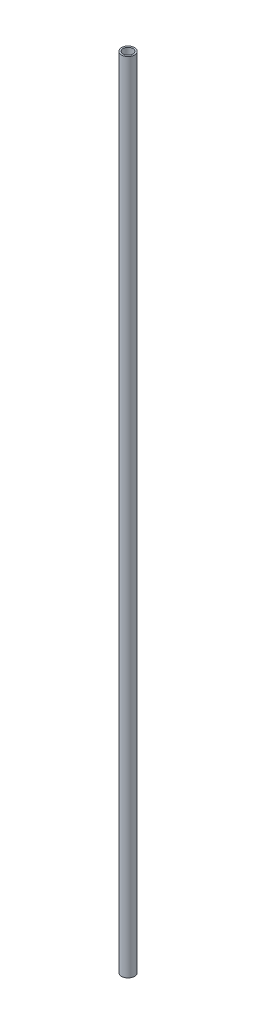
ISO-10303-21;
HEADER;
FILE_DESCRIPTION(('STEP AP214'),'2;1');
FILE_NAME('part.step','',(''),(''),'','','');
FILE_SCHEMA(('AUTOMOTIVE_DESIGN { 1 0 10303 214 1 1 1 1 }'));
ENDSEC;
DATA;
#1=APPLICATION_CONTEXT('core data for automotive mechanical design processes');
#2=APPLICATION_PROTOCOL_DEFINITION('international standard','automotive_design',2000,#1);
#3=PRODUCT_CONTEXT('',#1,'mechanical');
#4=PRODUCT('Part','Part','',(#3));
#5=PRODUCT_RELATED_PRODUCT_CATEGORY('part','',(#4));
#6=PRODUCT_DEFINITION_FORMATION('','',#4);
#7=PRODUCT_DEFINITION_CONTEXT('part definition',#1,'design');
#8=PRODUCT_DEFINITION('design','',#6,#7);
#9=PRODUCT_DEFINITION_SHAPE('','',#8);
#10=(LENGTH_UNIT() NAMED_UNIT(*) SI_UNIT(.MILLI.,.METRE.));
#11=(NAMED_UNIT(*) PLANE_ANGLE_UNIT() SI_UNIT($,.RADIAN.));
#12=(NAMED_UNIT(*) SI_UNIT($,.STERADIAN.) SOLID_ANGLE_UNIT());
#13=UNCERTAINTY_MEASURE_WITH_UNIT(LENGTH_MEASURE(1.E-05),#10,'distance_accuracy_value','');
#14=(GEOMETRIC_REPRESENTATION_CONTEXT(3) GLOBAL_UNCERTAINTY_ASSIGNED_CONTEXT((#13)) GLOBAL_UNIT_ASSIGNED_CONTEXT((#10,
#11,#12)) REPRESENTATION_CONTEXT('',''));
#15=CARTESIAN_POINT('',(0.,0.,0.));
#16=DIRECTION('',(0.,0.,1.));
#17=DIRECTION('',(1.,0.,0.));
#18=AXIS2_PLACEMENT_3D('',#15,#16,#17);
#19=CARTESIAN_POINT('',(0.,112.7,0.));
#20=DIRECTION('',(0.,1.,0.));
#21=DIRECTION('',(0.,0.,1.));
#22=AXIS2_PLACEMENT_3D('',#19,#20,#21);
#23=PLANE('',#22);
#24=CARTESIAN_POINT('',(0.,112.7,0.));
#25=DIRECTION('',(0.,1.,0.));
#26=DIRECTION('',(0.,0.,1.));
#27=AXIS2_PLACEMENT_3D('',#24,#25,#26);
#28=CIRCLE('',#27,0.9144);
#29=CARTESIAN_POINT('',(0.,112.7,-0.9144));
#30=VERTEX_POINT('',#29);
#31=EDGE_CURVE('E10',#30,#30,#28,.T.);
#32=ORIENTED_EDGE('',*,*,#31,.T.);
#33=EDGE_LOOP('',(#32));
#34=FACE_BOUND('',#33,.T.);
#35=CARTESIAN_POINT('',(0.,112.7,0.));
#36=DIRECTION('',(0.,1.,0.));
#37=DIRECTION('',(0.,0.,1.));
#38=AXIS2_PLACEMENT_3D('',#35,#36,#37);
#39=CIRCLE('',#38,0.6858);
#40=CARTESIAN_POINT('',(0.,112.7,-0.6858));
#41=VERTEX_POINT('',#40);
#42=EDGE_CURVE('E41',#41,#41,#39,.T.);
#43=ORIENTED_EDGE('',*,*,#42,.F.);
#44=EDGE_LOOP('',(#43));
#45=FACE_BOUND('',#44,.T.);
#46=ADVANCED_FACE('F30',(#34,#45),#23,.T.);
#47=CARTESIAN_POINT('',(0.,0.,0.));
#48=DIRECTION('',(0.,1.,0.));
#49=DIRECTION('',(0.,0.,1.));
#50=AXIS2_PLACEMENT_3D('',#47,#48,#49);
#51=PLANE('',#50);
#52=CARTESIAN_POINT('',(0.,0.,0.));
#53=DIRECTION('',(0.,1.,0.));
#54=DIRECTION('',(0.,0.,1.));
#55=AXIS2_PLACEMENT_3D('',#52,#53,#54);
#56=CIRCLE('',#55,0.9144);
#57=CARTESIAN_POINT('',(0.,0.,-0.9144));
#58=VERTEX_POINT('',#57);
#59=EDGE_CURVE('E34',#58,#58,#56,.T.);
#60=ORIENTED_EDGE('',*,*,#59,.F.);
#61=EDGE_LOOP('',(#60));
#62=FACE_BOUND('',#61,.T.);
#63=CARTESIAN_POINT('',(0.,0.,0.));
#64=DIRECTION('',(0.,1.,0.));
#65=DIRECTION('',(0.,0.,1.));
#66=AXIS2_PLACEMENT_3D('',#63,#64,#65);
#67=CIRCLE('',#66,0.6858);
#68=CARTESIAN_POINT('',(0.,0.,-0.6858));
#69=VERTEX_POINT('',#68);
#70=EDGE_CURVE('E43',#69,#69,#67,.T.);
#71=ORIENTED_EDGE('',*,*,#70,.T.);
#72=EDGE_LOOP('',(#71));
#73=FACE_BOUND('',#72,.T.);
#74=ADVANCED_FACE('F53',(#62,#73),#51,.F.);
#75=CARTESIAN_POINT('',(0.,112.7,0.));
#76=DIRECTION('',(0.,-1.,0.));
#77=DIRECTION('',(0.,0.,-1.));
#78=AXIS2_PLACEMENT_3D('',#75,#76,#77);
#79=CYLINDRICAL_SURFACE('',#78,0.9144);
#80=CARTESIAN_POINT('',(0.,112.7,-0.9144));
#81=CARTESIAN_POINT('',(0.,111.526041666667,-0.9144));
#82=CARTESIAN_POINT('',(0.,110.352083333333,-0.9144));
#83=CARTESIAN_POINT('',(0.,108.004166666667,-0.9144));
#84=CARTESIAN_POINT('',(0.,106.830208333333,-0.9144));
#85=CARTESIAN_POINT('',(0.,104.482291666667,-0.9144));
#86=CARTESIAN_POINT('',(0.,103.308333333333,-0.9144));
#87=CARTESIAN_POINT('',(0.,100.960416666667,-0.9144));
#88=CARTESIAN_POINT('',(0.,99.7864583333333,-0.9144));
#89=CARTESIAN_POINT('',(0.,97.4385416666667,-0.9144));
#90=CARTESIAN_POINT('',(0.,96.2645833333333,-0.9144));
#91=CARTESIAN_POINT('',(0.,93.9166666666667,-0.9144));
#92=CARTESIAN_POINT('',(0.,92.7427083333333,-0.9144));
#93=CARTESIAN_POINT('',(0.,90.3947916666667,-0.9144));
#94=CARTESIAN_POINT('',(0.,89.2208333333333,-0.9144));
#95=CARTESIAN_POINT('',(0.,86.8729166666667,-0.9144));
#96=CARTESIAN_POINT('',(0.,85.6989583333333,-0.9144));
#97=CARTESIAN_POINT('',(0.,83.3510416666667,-0.9144));
#98=CARTESIAN_POINT('',(0.,82.1770833333333,-0.9144));
#99=CARTESIAN_POINT('',(0.,79.8291666666667,-0.9144));
#100=CARTESIAN_POINT('',(0.,78.6552083333333,-0.9144));
#101=CARTESIAN_POINT('',(0.,76.3072916666667,-0.9144));
#102=CARTESIAN_POINT('',(0.,75.1333333333333,-0.9144));
#103=CARTESIAN_POINT('',(0.,72.7854166666667,-0.9144));
#104=CARTESIAN_POINT('',(0.,71.6114583333333,-0.9144));
#105=CARTESIAN_POINT('',(0.,69.2635416666667,-0.9144));
#106=CARTESIAN_POINT('',(0.,68.0895833333333,-0.9144));
#107=CARTESIAN_POINT('',(0.,65.7416666666667,-0.9144));
#108=CARTESIAN_POINT('',(0.,64.5677083333333,-0.9144));
#109=CARTESIAN_POINT('',(0.,62.2197916666667,-0.9144));
#110=CARTESIAN_POINT('',(0.,61.0458333333333,-0.9144));
#111=CARTESIAN_POINT('',(0.,58.6979166666667,-0.9144));
#112=CARTESIAN_POINT('',(0.,57.5239583333333,-0.9144));
#113=CARTESIAN_POINT('',(0.,55.1760416666667,-0.9144));
#114=CARTESIAN_POINT('',(0.,54.0020833333333,-0.9144));
#115=CARTESIAN_POINT('',(0.,51.6541666666667,-0.9144));
#116=CARTESIAN_POINT('',(0.,50.4802083333333,-0.9144));
#117=CARTESIAN_POINT('',(0.,48.1322916666667,-0.9144));
#118=CARTESIAN_POINT('',(0.,46.9583333333333,-0.9144));
#119=CARTESIAN_POINT('',(0.,44.6104166666667,-0.9144));
#120=CARTESIAN_POINT('',(0.,43.4364583333333,-0.9144));
#121=CARTESIAN_POINT('',(0.,41.0885416666667,-0.9144));
#122=CARTESIAN_POINT('',(0.,39.9145833333333,-0.9144));
#123=CARTESIAN_POINT('',(0.,37.5666666666667,-0.9144));
#124=CARTESIAN_POINT('',(0.,36.3927083333333,-0.9144));
#125=CARTESIAN_POINT('',(0.,34.0447916666667,-0.9144));
#126=CARTESIAN_POINT('',(0.,32.8708333333333,-0.9144));
#127=CARTESIAN_POINT('',(0.,30.5229166666667,-0.9144));
#128=CARTESIAN_POINT('',(0.,29.3489583333333,-0.9144));
#129=CARTESIAN_POINT('',(0.,27.0010416666667,-0.9144));
#130=CARTESIAN_POINT('',(0.,25.8270833333333,-0.9144));
#131=CARTESIAN_POINT('',(0.,23.4791666666667,-0.9144));
#132=CARTESIAN_POINT('',(0.,22.3052083333333,-0.9144));
#133=CARTESIAN_POINT('',(0.,19.9572916666667,-0.9144));
#134=CARTESIAN_POINT('',(0.,18.7833333333333,-0.9144));
#135=CARTESIAN_POINT('',(0.,16.4354166666667,-0.9144));
#136=CARTESIAN_POINT('',(0.,15.2614583333333,-0.9144));
#137=CARTESIAN_POINT('',(0.,12.9135416666667,-0.9144));
#138=CARTESIAN_POINT('',(0.,11.7395833333333,-0.9144));
#139=CARTESIAN_POINT('',(0.,9.39166666666666,-0.9144));
#140=CARTESIAN_POINT('',(0.,8.21770833333333,-0.9144));
#141=CARTESIAN_POINT('',(0.,5.86979166666667,-0.9144));
#142=CARTESIAN_POINT('',(0.,4.69583333333333,-0.9144));
#143=CARTESIAN_POINT('',(0.,2.34791666666666,-0.9144));
#144=CARTESIAN_POINT('',(0.,1.17395833333333,-0.9144));
#145=CARTESIAN_POINT('',(0.,0.,-0.9144));
#146=B_SPLINE_CURVE_WITH_KNOTS('',3,(#80,#81,#82,#83,#84,#85,#86,#87,#88,#89,#90,#91,#92,#93,
#94,#95,#96,#97,#98,#99,#100,#101,#102,#103,#104,#105,#106,#107,#108,#109,#110,#111,#112,#113,
#114,#115,#116,#117,#118,#119,#120,#121,#122,#123,#124,#125,#126,#127,#128,#129,#130,#131,#132,
#133,#134,#135,#136,#137,#138,#139,#140,#141,#142,#143,#144,#145),.UNSPECIFIED.,.F.,.F.,(4,2,2,
2,2,2,2,2,2,2,2,2,2,2,2,2,2,2,2,2,2,2,2,2,2,2,2,2,2,2,2,2,4),(0.,3.52187499999999,
7.04374999999999,10.565625,14.0875,17.609375,21.13125,24.653125,28.175,31.696875,35.21875,
38.740625,42.2625,45.784375,49.30625,52.828125,56.35,59.871875,63.39375,66.915625,70.4375,
73.959375,77.48125,81.003125,84.525,88.046875,91.56875,95.090625,98.6125,102.134375,105.65625,
109.178125,112.7),.UNSPECIFIED.);
#147=EDGE_CURVE('BSEAM32',#30,#58,#146,.T.);
#148=ORIENTED_EDGE('',*,*,#31,.F.);
#149=ORIENTED_EDGE('',*,*,#59,.T.);
#150=ORIENTED_EDGE('',*,*,#147,.T.);
#151=ORIENTED_EDGE('',*,*,#147,.F.);
#152=EDGE_LOOP('',(#148,#150,#149,#151));
#153=FACE_BOUND('',#152,.T.);
#154=ADVANCED_FACE('F32',(#153),#79,.T.);
#155=CARTESIAN_POINT('',(0.,112.7,0.));
#156=DIRECTION('',(0.,-1.,0.));
#157=DIRECTION('',(0.,0.,-1.));
#158=AXIS2_PLACEMENT_3D('',#155,#156,#157);
#159=CYLINDRICAL_SURFACE('',#158,0.6858);
#160=CARTESIAN_POINT('',(0.,112.7,-0.6858));
#161=CARTESIAN_POINT('',(0.,111.526041666667,-0.6858));
#162=CARTESIAN_POINT('',(0.,110.352083333333,-0.6858));
#163=CARTESIAN_POINT('',(0.,108.004166666667,-0.6858));
#164=CARTESIAN_POINT('',(0.,106.830208333333,-0.6858));
#165=CARTESIAN_POINT('',(0.,104.482291666667,-0.6858));
#166=CARTESIAN_POINT('',(0.,103.308333333333,-0.6858));
#167=CARTESIAN_POINT('',(0.,100.960416666667,-0.6858));
#168=CARTESIAN_POINT('',(0.,99.7864583333333,-0.6858));
#169=CARTESIAN_POINT('',(0.,97.4385416666667,-0.6858));
#170=CARTESIAN_POINT('',(0.,96.2645833333333,-0.6858));
#171=CARTESIAN_POINT('',(0.,93.9166666666667,-0.6858));
#172=CARTESIAN_POINT('',(0.,92.7427083333333,-0.6858));
#173=CARTESIAN_POINT('',(0.,90.3947916666667,-0.6858));
#174=CARTESIAN_POINT('',(0.,89.2208333333333,-0.6858));
#175=CARTESIAN_POINT('',(0.,86.8729166666667,-0.6858));
#176=CARTESIAN_POINT('',(0.,85.6989583333333,-0.6858));
#177=CARTESIAN_POINT('',(0.,83.3510416666667,-0.6858));
#178=CARTESIAN_POINT('',(0.,82.1770833333333,-0.6858));
#179=CARTESIAN_POINT('',(0.,79.8291666666667,-0.6858));
#180=CARTESIAN_POINT('',(0.,78.6552083333333,-0.6858));
#181=CARTESIAN_POINT('',(0.,76.3072916666667,-0.6858));
#182=CARTESIAN_POINT('',(0.,75.1333333333333,-0.6858));
#183=CARTESIAN_POINT('',(0.,72.7854166666667,-0.6858));
#184=CARTESIAN_POINT('',(0.,71.6114583333333,-0.6858));
#185=CARTESIAN_POINT('',(0.,69.2635416666667,-0.6858));
#186=CARTESIAN_POINT('',(0.,68.0895833333333,-0.6858));
#187=CARTESIAN_POINT('',(0.,65.7416666666667,-0.6858));
#188=CARTESIAN_POINT('',(0.,64.5677083333333,-0.6858));
#189=CARTESIAN_POINT('',(0.,62.2197916666667,-0.6858));
#190=CARTESIAN_POINT('',(0.,61.0458333333333,-0.6858));
#191=CARTESIAN_POINT('',(0.,58.6979166666667,-0.6858));
#192=CARTESIAN_POINT('',(0.,57.5239583333333,-0.6858));
#193=CARTESIAN_POINT('',(0.,55.1760416666667,-0.6858));
#194=CARTESIAN_POINT('',(0.,54.0020833333333,-0.6858));
#195=CARTESIAN_POINT('',(0.,51.6541666666667,-0.6858));
#196=CARTESIAN_POINT('',(0.,50.4802083333333,-0.6858));
#197=CARTESIAN_POINT('',(0.,48.1322916666667,-0.6858));
#198=CARTESIAN_POINT('',(0.,46.9583333333333,-0.6858));
#199=CARTESIAN_POINT('',(0.,44.6104166666667,-0.6858));
#200=CARTESIAN_POINT('',(0.,43.4364583333333,-0.6858));
#201=CARTESIAN_POINT('',(0.,41.0885416666667,-0.6858));
#202=CARTESIAN_POINT('',(0.,39.9145833333333,-0.6858));
#203=CARTESIAN_POINT('',(0.,37.5666666666667,-0.6858));
#204=CARTESIAN_POINT('',(0.,36.3927083333333,-0.6858));
#205=CARTESIAN_POINT('',(0.,34.0447916666667,-0.6858));
#206=CARTESIAN_POINT('',(0.,32.8708333333333,-0.6858));
#207=CARTESIAN_POINT('',(0.,30.5229166666667,-0.6858));
#208=CARTESIAN_POINT('',(0.,29.3489583333333,-0.6858));
#209=CARTESIAN_POINT('',(0.,27.0010416666667,-0.6858));
#210=CARTESIAN_POINT('',(0.,25.8270833333333,-0.6858));
#211=CARTESIAN_POINT('',(0.,23.4791666666667,-0.6858));
#212=CARTESIAN_POINT('',(0.,22.3052083333333,-0.6858));
#213=CARTESIAN_POINT('',(0.,19.9572916666667,-0.6858));
#214=CARTESIAN_POINT('',(0.,18.7833333333333,-0.6858));
#215=CARTESIAN_POINT('',(0.,16.4354166666667,-0.6858));
#216=CARTESIAN_POINT('',(0.,15.2614583333333,-0.6858));
#217=CARTESIAN_POINT('',(0.,12.9135416666667,-0.6858));
#218=CARTESIAN_POINT('',(0.,11.7395833333333,-0.6858));
#219=CARTESIAN_POINT('',(0.,9.39166666666666,-0.6858));
#220=CARTESIAN_POINT('',(0.,8.21770833333333,-0.6858));
#221=CARTESIAN_POINT('',(0.,5.86979166666667,-0.6858));
#222=CARTESIAN_POINT('',(0.,4.69583333333333,-0.6858));
#223=CARTESIAN_POINT('',(0.,2.34791666666666,-0.6858));
#224=CARTESIAN_POINT('',(0.,1.17395833333333,-0.6858));
#225=CARTESIAN_POINT('',(0.,0.,-0.6858));
#226=B_SPLINE_CURVE_WITH_KNOTS('',3,(#160,#161,#162,#163,#164,#165,#166,#167,#168,#169,#170,
#171,#172,#173,#174,#175,#176,#177,#178,#179,#180,#181,#182,#183,#184,#185,#186,#187,#188,#189,
#190,#191,#192,#193,#194,#195,#196,#197,#198,#199,#200,#201,#202,#203,#204,#205,#206,#207,#208,
#209,#210,#211,#212,#213,#214,#215,#216,#217,#218,#219,#220,#221,#222,#223,#224,#225),
.UNSPECIFIED.,.F.,.F.,(4,2,2,2,2,2,2,2,2,2,2,2,2,2,2,2,2,2,2,2,2,2,2,2,2,2,2,2,2,2,2,2,4),(0.,
3.52187499999999,7.04374999999999,10.565625,14.0875,17.609375,21.13125,24.653125,28.175,
31.696875,35.21875,38.740625,42.2625,45.784375,49.30625,52.828125,56.35,59.871875,63.39375,
66.915625,70.4375,73.959375,77.48125,81.003125,84.525,88.046875,91.56875,95.090625,98.6125,
102.134375,105.65625,109.178125,112.7),.UNSPECIFIED.);
#227=EDGE_CURVE('BSEAM49',#41,#69,#226,.T.);
#228=ORIENTED_EDGE('',*,*,#42,.T.);
#229=ORIENTED_EDGE('',*,*,#70,.F.);
#230=ORIENTED_EDGE('',*,*,#227,.T.);
#231=ORIENTED_EDGE('',*,*,#227,.F.);
#232=EDGE_LOOP('',(#228,#230,#229,#231));
#233=FACE_BOUND('',#232,.T.);
#234=ADVANCED_FACE('F49',(#233),#159,.F.);
#235=CLOSED_SHELL('',(#46,#74,#154,#234));
#236=MANIFOLD_SOLID_BREP('B2',#235);
#237=ADVANCED_BREP_SHAPE_REPRESENTATION('',(#18,#236),#14);
#238=SHAPE_DEFINITION_REPRESENTATION(#9,#237);
ENDSEC;
END-ISO-10303-21;
